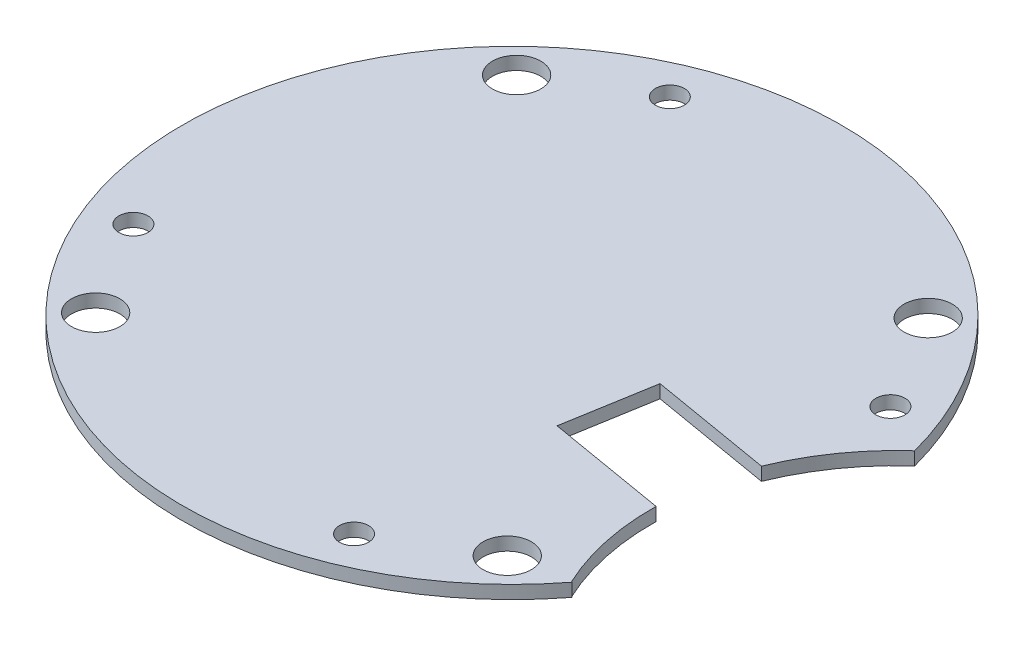
ISO-10303-21;
HEADER;
FILE_DESCRIPTION(('STEP AP214'),'2;1');
FILE_NAME('part.step','',(''),(''),'','','');
FILE_SCHEMA(('AUTOMOTIVE_DESIGN { 1 0 10303 214 1 1 1 1 }'));
ENDSEC;
DATA;
#1=APPLICATION_CONTEXT('core data for automotive mechanical design processes');
#2=APPLICATION_PROTOCOL_DEFINITION('international standard','automotive_design',2000,#1);
#3=PRODUCT_CONTEXT('',#1,'mechanical');
#4=PRODUCT('Part','Part','',(#3));
#5=PRODUCT_RELATED_PRODUCT_CATEGORY('part','',(#4));
#6=PRODUCT_DEFINITION_FORMATION('','',#4);
#7=PRODUCT_DEFINITION_CONTEXT('part definition',#1,'design');
#8=PRODUCT_DEFINITION('design','',#6,#7);
#9=PRODUCT_DEFINITION_SHAPE('','',#8);
#10=(LENGTH_UNIT() NAMED_UNIT(*) SI_UNIT(.MILLI.,.METRE.));
#11=(NAMED_UNIT(*) PLANE_ANGLE_UNIT() SI_UNIT($,.RADIAN.));
#12=(NAMED_UNIT(*) SI_UNIT($,.STERADIAN.) SOLID_ANGLE_UNIT());
#13=UNCERTAINTY_MEASURE_WITH_UNIT(LENGTH_MEASURE(1.E-05),#10,'distance_accuracy_value','');
#14=(GEOMETRIC_REPRESENTATION_CONTEXT(3) GLOBAL_UNCERTAINTY_ASSIGNED_CONTEXT((#13)) GLOBAL_UNIT_ASSIGNED_CONTEXT((#10,
#11,#12)) REPRESENTATION_CONTEXT('',''));
#15=CARTESIAN_POINT('',(0.,0.,0.));
#16=DIRECTION('',(0.,0.,1.));
#17=DIRECTION('',(1.,0.,0.));
#18=AXIS2_PLACEMENT_3D('',#15,#16,#17);
#19=CARTESIAN_POINT('',(0.,1.5,0.));
#20=DIRECTION('',(0.,-1.,0.));
#21=DIRECTION('',(0.,0.,-1.));
#22=AXIS2_PLACEMENT_3D('',#19,#20,#21);
#23=CYLINDRICAL_SURFACE('',#22,37.5);
#24=CARTESIAN_POINT('',(0.,0.,0.));
#25=DIRECTION('',(0.,1.,0.));
#26=DIRECTION('',(0.,0.,1.));
#27=AXIS2_PLACEMENT_3D('',#24,#25,#26);
#28=CIRCLE('',#27,37.5);
#29=CARTESIAN_POINT('',(36.2683420266121,0.,-9.53191306300501));
#30=VERTEX_POINT('',#29);
#31=CARTESIAN_POINT('',(29.7006641780445,0.,22.89367920154));
#32=VERTEX_POINT('',#31);
#33=EDGE_CURVE('E161',#30,#32,#28,.T.);
#34=ORIENTED_EDGE('',*,*,#33,.T.);
#35=DIRECTION('',(0.,1.,0.));
#36=VECTOR('',#35,1.);
#37=CARTESIAN_POINT('',(29.7006641780445,1.5,22.89367920154));
#38=LINE('',#37,#36);
#39=CARTESIAN_POINT('',(29.7006641780445,1.5,22.89367920154));
#40=VERTEX_POINT('',#39);
#41=EDGE_CURVE('E203',#32,#40,#38,.T.);
#42=ORIENTED_EDGE('',*,*,#41,.T.);
#43=CARTESIAN_POINT('',(0.,1.5,0.));
#44=DIRECTION('',(0.,1.,0.));
#45=DIRECTION('',(0.,0.,1.));
#46=AXIS2_PLACEMENT_3D('',#43,#44,#45);
#47=CIRCLE('',#46,37.5);
#48=CARTESIAN_POINT('',(36.2683420266121,1.5,-9.531913063005));
#49=VERTEX_POINT('',#48);
#50=EDGE_CURVE('E164',#49,#40,#47,.T.);
#51=ORIENTED_EDGE('',*,*,#50,.F.);
#52=DIRECTION('',(0.,1.,0.));
#53=VECTOR('',#52,1.);
#54=CARTESIAN_POINT('',(36.2683420266121,1.5,-9.531913063005));
#55=LINE('',#54,#53);
#56=EDGE_CURVE('E208',#49,#30,#55,.F.);
#57=ORIENTED_EDGE('',*,*,#56,.T.);
#58=EDGE_LOOP('',(#34,#42,#51,#57));
#59=FACE_BOUND('',#58,.T.);
#60=ADVANCED_FACE('F41',(#59),#23,.T.);
#61=CARTESIAN_POINT('',(0.,1.5,0.));
#62=DIRECTION('',(0.,1.,0.));
#63=DIRECTION('',(0.,0.,1.));
#64=AXIS2_PLACEMENT_3D('',#61,#62,#63);
#65=PLANE('',#64);
#66=CARTESIAN_POINT('',(23.0939339103995,1.5,4.67758667111403));
#67=DIRECTION('',(0.,1.,0.));
#68=DIRECTION('',(0.,0.,1.));
#69=AXIS2_PLACEMENT_3D('',#66,#67,#68);
#70=CIRCLE('',#69,19.3771750238898);
#71=CARTESIAN_POINT('',(36.2429687450715,1.5,-9.55539596862244));
#72=VERTEX_POINT('',#71);
#73=EDGE_CURVE('E206',#49,#72,#70,.T.);
#74=ORIENTED_EDGE('',*,*,#73,.F.);
#75=ORIENTED_EDGE('',*,*,#50,.T.);
#76=CARTESIAN_POINT('',(29.6578955464331,1.5,22.9091340422822));
#77=VERTEX_POINT('',#76);
#78=EDGE_CURVE('E202',#77,#40,#70,.T.);
#79=ORIENTED_EDGE('',*,*,#78,.F.);
#80=CARTESIAN_POINT('',(54.762257661761,1.5,11.1011581785659));
#81=DIRECTION('',(0.,1.,0.));
#82=DIRECTION('',(0.,0.,1.));
#83=AXIS2_PLACEMENT_3D('',#80,#81,#82);
#84=CIRCLE('',#83,27.7426979801103);
#85=CARTESIAN_POINT('',(27.0236814137866,1.5,10.6229542984922));
#86=VERTEX_POINT('',#85);
#87=EDGE_CURVE('E211',#86,#77,#84,.T.);
#88=ORIENTED_EDGE('',*,*,#87,.F.);
#89=DIRECTION('',(0.985864938916429,0.,0.167542001346843));
#90=VECTOR('',#89,1.);
#91=CARTESIAN_POINT('',(-0.99607012382513,1.5,5.86116080676652));
#92=LINE('',#91,#90);
#93=CARTESIAN_POINT('',(13.4506851765629,1.5,8.31630268315321));
#94=VERTEX_POINT('',#93);
#95=EDGE_CURVE('E213',#94,#86,#92,.T.);
#96=ORIENTED_EDGE('',*,*,#95,.F.);
#97=DIRECTION('',(-0.167542001346393,0.,0.985864938916506));
#98=VECTOR('',#97,1.);
#99=CARTESIAN_POINT('',(14.4467553003865,1.5,2.45514187637964));
#100=LINE('',#99,#98);
#101=CARTESIAN_POINT('',(15.1529110591266,1.5,-1.70008008803095));
#102=VERTEX_POINT('',#101);
#103=EDGE_CURVE('E215',#102,#94,#100,.T.);
#104=ORIENTED_EDGE('',*,*,#103,.F.);
#105=DIRECTION('',(-0.985864938916489,0.,-0.167542001346492));
#106=VECTOR('',#105,1.);
#107=CARTESIAN_POINT('',(0.706155758740759,1.5,-4.15522196441197));
#108=LINE('',#107,#106);
#109=CARTESIAN_POINT('',(29.0581188998045,1.5,0.663028953382543));
#110=VERTEX_POINT('',#109);
#111=EDGE_CURVE('E123',#110,#102,#108,.T.);
#112=ORIENTED_EDGE('',*,*,#111,.F.);
#113=CARTESIAN_POINT('',(54.762257661761,1.5,11.1011581785659));
#114=DIRECTION('',(0.,1.,0.));
#115=DIRECTION('',(0.,0.,1.));
#116=AXIS2_PLACEMENT_3D('',#113,#114,#115);
#117=CIRCLE('',#116,27.7426979801089);
#118=EDGE_CURVE('E65',#72,#110,#117,.T.);
#119=ORIENTED_EDGE('',*,*,#118,.F.);
#120=EDGE_LOOP('',(#74,#75,#79,#88,#96,#104,#112,#119));
#121=FACE_BOUND('',#120,.T.);
#122=CARTESIAN_POINT('',(-30.519872413592,1.5,12.5513898773731));
#123=DIRECTION('',(0.,1.,0.));
#124=DIRECTION('',(0.,0.,1.));
#125=AXIS2_PLACEMENT_3D('',#122,#123,#124);
#126=CIRCLE('',#125,1.65);
#127=CARTESIAN_POINT('',(-30.519872413592,1.5,14.2013898773731));
#128=VERTEX_POINT('',#127);
#129=EDGE_CURVE('E179',#128,#128,#126,.T.);
#130=ORIENTED_EDGE('',*,*,#129,.F.);
#131=EDGE_LOOP('',(#130));
#132=FACE_BOUND('',#131,.T.);
#133=CARTESIAN_POINT('',(23.9495809610721,1.5,-23.416394486041));
#134=DIRECTION('',(0.,1.,0.));
#135=DIRECTION('',(0.,0.,1.));
#136=AXIS2_PLACEMENT_3D('',#133,#134,#135);
#137=CIRCLE('',#136,2.75);
#138=CARTESIAN_POINT('',(23.9495809610721,1.5,-20.666394486041));
#139=VERTEX_POINT('',#138);
#140=EDGE_CURVE('E187',#139,#139,#137,.T.);
#141=ORIENTED_EDGE('',*,*,#140,.F.);
#142=EDGE_LOOP('',(#141));
#143=FACE_BOUND('',#142,.T.);
#144=CARTESIAN_POINT('',(23.4163944860967,1.5,23.9495809610161));
#145=DIRECTION('',(0.,1.,0.));
#146=DIRECTION('',(0.,0.,1.));
#147=AXIS2_PLACEMENT_3D('',#144,#145,#146);
#148=CIRCLE('',#147,2.75000000006971);
#149=CARTESIAN_POINT('',(23.4163944860967,1.5,26.6995809610858));
#150=VERTEX_POINT('',#149);
#151=EDGE_CURVE('E183',#150,#150,#148,.T.);
#152=ORIENTED_EDGE('',*,*,#151,.F.);
#153=EDGE_LOOP('',(#152));
#154=FACE_BOUND('',#153,.T.);
#155=CARTESIAN_POINT('',(-23.9495809609604,1.5,23.4163944860408));
#156=DIRECTION('',(0.,1.,0.));
#157=DIRECTION('',(0.,0.,1.));
#158=AXIS2_PLACEMENT_3D('',#155,#156,#157);
#159=CIRCLE('',#158,2.75000000003257);
#160=CARTESIAN_POINT('',(-23.9495809609604,1.5,26.1663944860733));
#161=VERTEX_POINT('',#160);
#162=EDGE_CURVE('E180',#161,#161,#159,.T.);
#163=ORIENTED_EDGE('',*,*,#162,.F.);
#164=EDGE_LOOP('',(#163));
#165=FACE_BOUND('',#164,.T.);
#166=CARTESIAN_POINT('',(-12.5513898771988,1.5,-30.5198724139989));
#167=DIRECTION('',(0.,1.,0.));
#168=DIRECTION('',(0.,0.,1.));
#169=AXIS2_PLACEMENT_3D('',#166,#167,#168);
#170=CIRCLE('',#169,1.65);
#171=CARTESIAN_POINT('',(-12.5513898771988,1.5,-28.8698724139989));
#172=VERTEX_POINT('',#171);
#173=EDGE_CURVE('E184',#172,#172,#170,.T.);
#174=ORIENTED_EDGE('',*,*,#173,.F.);
#175=EDGE_LOOP('',(#174));
#176=FACE_BOUND('',#175,.T.);
#177=CARTESIAN_POINT('',(30.5198724141732,1.5,-12.5513898776057));
#178=DIRECTION('',(0.,1.,0.));
#179=DIRECTION('',(0.,0.,1.));
#180=AXIS2_PLACEMENT_3D('',#177,#178,#179);
#181=CIRCLE('',#180,1.65);
#182=CARTESIAN_POINT('',(30.5198724141732,1.5,-10.9013898776057));
#183=VERTEX_POINT('',#182);
#184=EDGE_CURVE('E195',#183,#183,#181,.T.);
#185=ORIENTED_EDGE('',*,*,#184,.F.);
#186=EDGE_LOOP('',(#185));
#187=FACE_BOUND('',#186,.T.);
#188=CARTESIAN_POINT('',(12.55138987778,1.5,30.5198724137663));
#189=DIRECTION('',(0.,1.,0.));
#190=DIRECTION('',(0.,0.,1.));
#191=AXIS2_PLACEMENT_3D('',#188,#189,#190);
#192=CIRCLE('',#191,1.65);
#193=CARTESIAN_POINT('',(12.55138987778,1.5,32.1698724137663));
#194=VERTEX_POINT('',#193);
#195=EDGE_CURVE('E192',#194,#194,#192,.T.);
#196=ORIENTED_EDGE('',*,*,#195,.F.);
#197=EDGE_LOOP('',(#196));
#198=FACE_BOUND('',#197,.T.);
#199=CARTESIAN_POINT('',(-23.4163944859851,1.5,-23.9495809610164));
#200=DIRECTION('',(0.,1.,0.));
#201=DIRECTION('',(0.,0.,1.));
#202=AXIS2_PLACEMENT_3D('',#199,#200,#201);
#203=CIRCLE('',#202,2.74999999996265);
#204=CARTESIAN_POINT('',(-23.4163944859851,1.5,-21.1995809610538));
#205=VERTEX_POINT('',#204);
#206=EDGE_CURVE('E160',#205,#205,#203,.T.);
#207=ORIENTED_EDGE('',*,*,#206,.F.);
#208=EDGE_LOOP('',(#207));
#209=FACE_BOUND('',#208,.T.);
#210=ADVANCED_FACE('F229',(#121,#132,#143,#154,#165,#176,#187,#198,#209),#65,.T.);
#211=CARTESIAN_POINT('',(0.,0.,0.));
#212=DIRECTION('',(0.,1.,0.));
#213=DIRECTION('',(0.,0.,1.));
#214=AXIS2_PLACEMENT_3D('',#211,#212,#213);
#215=PLANE('',#214);
#216=ORIENTED_EDGE('',*,*,#33,.F.);
#217=CARTESIAN_POINT('',(23.0939339103995,0.,4.67758667111403));
#218=DIRECTION('',(0.,1.,0.));
#219=DIRECTION('',(0.,0.,1.));
#220=AXIS2_PLACEMENT_3D('',#217,#218,#219);
#221=CIRCLE('',#220,19.3771750238898);
#222=CARTESIAN_POINT('',(36.2429687450715,0.,-9.55539596862244));
#223=VERTEX_POINT('',#222);
#224=EDGE_CURVE('E11',#30,#223,#221,.T.);
#225=ORIENTED_EDGE('',*,*,#224,.T.);
#226=CARTESIAN_POINT('',(54.762257661761,0.,11.1011581785659));
#227=DIRECTION('',(0.,1.,0.));
#228=DIRECTION('',(0.,0.,1.));
#229=AXIS2_PLACEMENT_3D('',#226,#227,#228);
#230=CIRCLE('',#229,27.7426979801089);
#231=CARTESIAN_POINT('',(29.0581188998045,0.,0.663028953382543));
#232=VERTEX_POINT('',#231);
#233=EDGE_CURVE('E44',#223,#232,#230,.T.);
#234=ORIENTED_EDGE('',*,*,#233,.T.);
#235=DIRECTION('',(-0.985864938916489,0.,-0.167542001346492));
#236=VECTOR('',#235,1.);
#237=CARTESIAN_POINT('',(0.706155758740759,0.,-4.15522196441197));
#238=LINE('',#237,#236);
#239=CARTESIAN_POINT('',(15.1529110591266,0.,-1.70008008803095));
#240=VERTEX_POINT('',#239);
#241=EDGE_CURVE('E121',#232,#240,#238,.T.);
#242=ORIENTED_EDGE('',*,*,#241,.T.);
#243=DIRECTION('',(-0.167542001346393,0.,0.985864938916506));
#244=VECTOR('',#243,1.);
#245=CARTESIAN_POINT('',(14.4467553003865,0.,2.45514187637964));
#246=LINE('',#245,#244);
#247=CARTESIAN_POINT('',(13.4506851765629,0.,8.31630268315321));
#248=VERTEX_POINT('',#247);
#249=EDGE_CURVE('E108',#240,#248,#246,.T.);
#250=ORIENTED_EDGE('',*,*,#249,.T.);
#251=DIRECTION('',(0.985864938916429,0.,0.167542001346843));
#252=VECTOR('',#251,1.);
#253=CARTESIAN_POINT('',(-0.99607012382513,0.,5.86116080676652));
#254=LINE('',#253,#252);
#255=CARTESIAN_POINT('',(27.0236814137866,0.,10.6229542984922));
#256=VERTEX_POINT('',#255);
#257=EDGE_CURVE('E116',#248,#256,#254,.T.);
#258=ORIENTED_EDGE('',*,*,#257,.T.);
#259=CARTESIAN_POINT('',(54.762257661761,0.,11.1011581785659));
#260=DIRECTION('',(0.,1.,0.));
#261=DIRECTION('',(0.,0.,1.));
#262=AXIS2_PLACEMENT_3D('',#259,#260,#261);
#263=CIRCLE('',#262,27.7426979801103);
#264=CARTESIAN_POINT('',(29.6578955464331,0.,22.9091340422822));
#265=VERTEX_POINT('',#264);
#266=EDGE_CURVE('E130',#256,#265,#263,.T.);
#267=ORIENTED_EDGE('',*,*,#266,.T.);
#268=EDGE_CURVE('E50',#265,#32,#221,.T.);
#269=ORIENTED_EDGE('',*,*,#268,.T.);
#270=EDGE_LOOP('',(#216,#225,#234,#242,#250,#258,#267,#269));
#271=FACE_BOUND('',#270,.T.);
#272=CARTESIAN_POINT('',(-30.519872413592,0.,12.5513898773731));
#273=DIRECTION('',(0.,1.,0.));
#274=DIRECTION('',(0.,0.,1.));
#275=AXIS2_PLACEMENT_3D('',#272,#273,#274);
#276=CIRCLE('',#275,1.65);
#277=CARTESIAN_POINT('',(-30.519872413592,0.,14.2013898773731));
#278=VERTEX_POINT('',#277);
#279=EDGE_CURVE('E135',#278,#278,#276,.T.);
#280=ORIENTED_EDGE('',*,*,#279,.T.);
#281=EDGE_LOOP('',(#280));
#282=FACE_BOUND('',#281,.T.);
#283=CARTESIAN_POINT('',(23.9495809610721,0.,-23.416394486041));
#284=DIRECTION('',(0.,1.,0.));
#285=DIRECTION('',(0.,0.,1.));
#286=AXIS2_PLACEMENT_3D('',#283,#284,#285);
#287=CIRCLE('',#286,2.75);
#288=CARTESIAN_POINT('',(23.9495809610721,0.,-20.666394486041));
#289=VERTEX_POINT('',#288);
#290=EDGE_CURVE('E139',#289,#289,#287,.T.);
#291=ORIENTED_EDGE('',*,*,#290,.T.);
#292=EDGE_LOOP('',(#291));
#293=FACE_BOUND('',#292,.T.);
#294=CARTESIAN_POINT('',(23.4163944860967,0.,23.9495809610161));
#295=DIRECTION('',(0.,1.,0.));
#296=DIRECTION('',(0.,0.,1.));
#297=AXIS2_PLACEMENT_3D('',#294,#295,#296);
#298=CIRCLE('',#297,2.75000000006971);
#299=CARTESIAN_POINT('',(23.4163944860967,0.,26.6995809610858));
#300=VERTEX_POINT('',#299);
#301=EDGE_CURVE('E142',#300,#300,#298,.T.);
#302=ORIENTED_EDGE('',*,*,#301,.T.);
#303=EDGE_LOOP('',(#302));
#304=FACE_BOUND('',#303,.T.);
#305=CARTESIAN_POINT('',(-23.9495809609604,0.,23.4163944860408));
#306=DIRECTION('',(0.,1.,0.));
#307=DIRECTION('',(0.,0.,1.));
#308=AXIS2_PLACEMENT_3D('',#305,#306,#307);
#309=CIRCLE('',#308,2.75000000003257);
#310=CARTESIAN_POINT('',(-23.9495809609604,0.,26.1663944860733));
#311=VERTEX_POINT('',#310);
#312=EDGE_CURVE('E145',#311,#311,#309,.T.);
#313=ORIENTED_EDGE('',*,*,#312,.T.);
#314=EDGE_LOOP('',(#313));
#315=FACE_BOUND('',#314,.T.);
#316=CARTESIAN_POINT('',(-12.5513898771988,0.,-30.5198724139989));
#317=DIRECTION('',(0.,1.,0.));
#318=DIRECTION('',(0.,0.,1.));
#319=AXIS2_PLACEMENT_3D('',#316,#317,#318);
#320=CIRCLE('',#319,1.65);
#321=CARTESIAN_POINT('',(-12.5513898771988,0.,-28.8698724139989));
#322=VERTEX_POINT('',#321);
#323=EDGE_CURVE('E148',#322,#322,#320,.T.);
#324=ORIENTED_EDGE('',*,*,#323,.T.);
#325=EDGE_LOOP('',(#324));
#326=FACE_BOUND('',#325,.T.);
#327=CARTESIAN_POINT('',(30.5198724141732,0.,-12.5513898776057));
#328=DIRECTION('',(0.,1.,0.));
#329=DIRECTION('',(0.,0.,1.));
#330=AXIS2_PLACEMENT_3D('',#327,#328,#329);
#331=CIRCLE('',#330,1.65);
#332=CARTESIAN_POINT('',(30.5198724141732,0.,-10.9013898776057));
#333=VERTEX_POINT('',#332);
#334=EDGE_CURVE('E151',#333,#333,#331,.T.);
#335=ORIENTED_EDGE('',*,*,#334,.T.);
#336=EDGE_LOOP('',(#335));
#337=FACE_BOUND('',#336,.T.);
#338=CARTESIAN_POINT('',(12.55138987778,0.,30.5198724137663));
#339=DIRECTION('',(0.,1.,0.));
#340=DIRECTION('',(0.,0.,1.));
#341=AXIS2_PLACEMENT_3D('',#338,#339,#340);
#342=CIRCLE('',#341,1.65);
#343=CARTESIAN_POINT('',(12.55138987778,0.,32.1698724137663));
#344=VERTEX_POINT('',#343);
#345=EDGE_CURVE('E154',#344,#344,#342,.T.);
#346=ORIENTED_EDGE('',*,*,#345,.T.);
#347=EDGE_LOOP('',(#346));
#348=FACE_BOUND('',#347,.T.);
#349=CARTESIAN_POINT('',(-23.4163944859851,0.,-23.9495809610164));
#350=DIRECTION('',(0.,1.,0.));
#351=DIRECTION('',(0.,0.,1.));
#352=AXIS2_PLACEMENT_3D('',#349,#350,#351);
#353=CIRCLE('',#352,2.74999999996265);
#354=CARTESIAN_POINT('',(-23.4163944859851,0.,-21.1995809610538));
#355=VERTEX_POINT('',#354);
#356=EDGE_CURVE('E157',#355,#355,#353,.T.);
#357=ORIENTED_EDGE('',*,*,#356,.T.);
#358=EDGE_LOOP('',(#357));
#359=FACE_BOUND('',#358,.T.);
#360=CARTESIAN_POINT('',(0.,0.,0.));
#361=DIRECTION('',(0.,-1.,0.));
#362=DIRECTION('',(0.,0.,-1.));
#363=AXIS2_PLACEMENT_3D('',#360,#361,#362);
#364=CIRCLE('',#363,7.25);
#365=CARTESIAN_POINT('',(0.,0.,-7.25));
#366=VERTEX_POINT('',#365);
#367=EDGE_CURVE('E117',#366,#366,#364,.T.);
#368=ORIENTED_EDGE('',*,*,#367,.F.);
#369=EDGE_LOOP('',(#368));
#370=FACE_BOUND('',#369,.T.);
#371=ADVANCED_FACE('F127',(#271,#282,#293,#304,#315,#326,#337,#348,#359,#370),#215,.F.);
#372=CARTESIAN_POINT('',(0.,-6.,0.));
#373=DIRECTION('',(0.,1.,0.));
#374=DIRECTION('',(0.,0.,1.));
#375=AXIS2_PLACEMENT_3D('',#372,#373,#374);
#376=CYLINDRICAL_SURFACE('',#375,7.25);
#377=CARTESIAN_POINT('',(0.,-6.,0.));
#378=DIRECTION('',(0.,-1.,0.));
#379=DIRECTION('',(0.,0.,-1.));
#380=AXIS2_PLACEMENT_3D('',#377,#378,#379);
#381=CIRCLE('',#380,7.25);
#382=CARTESIAN_POINT('',(0.,-6.,-7.25));
#383=VERTEX_POINT('',#382);
#384=EDGE_CURVE('E165',#383,#383,#381,.T.);
#385=ORIENTED_EDGE('',*,*,#384,.F.);
#386=EDGE_LOOP('',(#385));
#387=FACE_BOUND('',#386,.T.);
#388=ORIENTED_EDGE('',*,*,#367,.T.);
#389=EDGE_LOOP('',(#388));
#390=FACE_BOUND('',#389,.T.);
#391=ADVANCED_FACE('F266',(#387,#390),#376,.T.);
#392=CARTESIAN_POINT('',(0.,-6.,0.));
#393=DIRECTION('',(0.,-1.,0.));
#394=DIRECTION('',(0.,0.,-1.));
#395=AXIS2_PLACEMENT_3D('',#392,#393,#394);
#396=PLANE('',#395);
#397=CARTESIAN_POINT('',(0.,-6.,0.));
#398=DIRECTION('',(0.,-1.,0.));
#399=DIRECTION('',(0.,0.,-1.));
#400=AXIS2_PLACEMENT_3D('',#397,#398,#399);
#401=CIRCLE('',#400,5.5);
#402=CARTESIAN_POINT('',(0.,-6.,-5.5));
#403=VERTEX_POINT('',#402);
#404=EDGE_CURVE('E138',#403,#403,#401,.T.);
#405=ORIENTED_EDGE('',*,*,#404,.F.);
#406=EDGE_LOOP('',(#405));
#407=FACE_BOUND('',#406,.T.);
#408=ORIENTED_EDGE('',*,*,#384,.T.);
#409=EDGE_LOOP('',(#408));
#410=FACE_BOUND('',#409,.T.);
#411=ADVANCED_FACE('F270',(#407,#410),#396,.T.);
#412=CARTESIAN_POINT('',(0.,1.,0.));
#413=DIRECTION('',(0.,-1.,0.));
#414=DIRECTION('',(0.,0.,-1.));
#415=AXIS2_PLACEMENT_3D('',#412,#413,#414);
#416=CYLINDRICAL_SURFACE('',#415,5.5);
#417=CARTESIAN_POINT('',(0.,1.,0.));
#418=DIRECTION('',(0.,-1.,0.));
#419=DIRECTION('',(0.,0.,-1.));
#420=AXIS2_PLACEMENT_3D('',#417,#418,#419);
#421=CIRCLE('',#420,5.5);
#422=CARTESIAN_POINT('',(0.,1.,-5.5));
#423=VERTEX_POINT('',#422);
#424=EDGE_CURVE('E172',#423,#423,#421,.T.);
#425=ORIENTED_EDGE('',*,*,#424,.F.);
#426=EDGE_LOOP('',(#425));
#427=FACE_BOUND('',#426,.T.);
#428=ORIENTED_EDGE('',*,*,#404,.T.);
#429=EDGE_LOOP('',(#428));
#430=FACE_BOUND('',#429,.T.);
#431=ADVANCED_FACE('F274',(#427,#430),#416,.F.);
#432=CARTESIAN_POINT('',(0.,1.,0.));
#433=DIRECTION('',(0.,-1.,0.));
#434=DIRECTION('',(0.,0.,-1.));
#435=AXIS2_PLACEMENT_3D('',#432,#433,#434);
#436=PLANE('',#435);
#437=ORIENTED_EDGE('',*,*,#424,.T.);
#438=EDGE_LOOP('',(#437));
#439=FACE_BOUND('',#438,.T.);
#440=ADVANCED_FACE('F278',(#439),#436,.T.);
#441=CARTESIAN_POINT('',(-23.4163944859851,-8.5,-23.9495809610164));
#442=DIRECTION('',(0.,1.,0.));
#443=DIRECTION('',(0.,0.,1.));
#444=AXIS2_PLACEMENT_3D('',#441,#442,#443);
#445=CYLINDRICAL_SURFACE('',#444,2.74999999996265);
#446=ORIENTED_EDGE('',*,*,#206,.T.);
#447=EDGE_LOOP('',(#446));
#448=FACE_BOUND('',#447,.T.);
#449=ORIENTED_EDGE('',*,*,#356,.F.);
#450=EDGE_LOOP('',(#449));
#451=FACE_BOUND('',#450,.T.);
#452=ADVANCED_FACE('F282',(#448,#451),#445,.F.);
#453=CARTESIAN_POINT('',(12.55138987778,-8.5,30.5198724137663));
#454=DIRECTION('',(0.,1.,0.));
#455=DIRECTION('',(0.,0.,1.));
#456=AXIS2_PLACEMENT_3D('',#453,#454,#455);
#457=CYLINDRICAL_SURFACE('',#456,1.65);
#458=ORIENTED_EDGE('',*,*,#195,.T.);
#459=EDGE_LOOP('',(#458));
#460=FACE_BOUND('',#459,.T.);
#461=ORIENTED_EDGE('',*,*,#345,.F.);
#462=EDGE_LOOP('',(#461));
#463=FACE_BOUND('',#462,.T.);
#464=ADVANCED_FACE('F286',(#460,#463),#457,.F.);
#465=CARTESIAN_POINT('',(30.5198724141732,-8.5,-12.5513898776057));
#466=DIRECTION('',(0.,1.,0.));
#467=DIRECTION('',(0.,0.,1.));
#468=AXIS2_PLACEMENT_3D('',#465,#466,#467);
#469=CYLINDRICAL_SURFACE('',#468,1.65);
#470=ORIENTED_EDGE('',*,*,#184,.T.);
#471=EDGE_LOOP('',(#470));
#472=FACE_BOUND('',#471,.T.);
#473=ORIENTED_EDGE('',*,*,#334,.F.);
#474=EDGE_LOOP('',(#473));
#475=FACE_BOUND('',#474,.T.);
#476=ADVANCED_FACE('F305',(#472,#475),#469,.F.);
#477=CARTESIAN_POINT('',(-12.5513898771988,-8.5,-30.5198724139989));
#478=DIRECTION('',(0.,1.,0.));
#479=DIRECTION('',(0.,0.,1.));
#480=AXIS2_PLACEMENT_3D('',#477,#478,#479);
#481=CYLINDRICAL_SURFACE('',#480,1.65);
#482=ORIENTED_EDGE('',*,*,#173,.T.);
#483=EDGE_LOOP('',(#482));
#484=FACE_BOUND('',#483,.T.);
#485=ORIENTED_EDGE('',*,*,#323,.F.);
#486=EDGE_LOOP('',(#485));
#487=FACE_BOUND('',#486,.T.);
#488=ADVANCED_FACE('F292',(#484,#487),#481,.F.);
#489=CARTESIAN_POINT('',(-23.9495809609604,-8.5,23.4163944860408));
#490=DIRECTION('',(0.,1.,0.));
#491=DIRECTION('',(0.,0.,1.));
#492=AXIS2_PLACEMENT_3D('',#489,#490,#491);
#493=CYLINDRICAL_SURFACE('',#492,2.75000000003257);
#494=ORIENTED_EDGE('',*,*,#162,.T.);
#495=EDGE_LOOP('',(#494));
#496=FACE_BOUND('',#495,.T.);
#497=ORIENTED_EDGE('',*,*,#312,.F.);
#498=EDGE_LOOP('',(#497));
#499=FACE_BOUND('',#498,.T.);
#500=ADVANCED_FACE('F288',(#496,#499),#493,.F.);
#501=CARTESIAN_POINT('',(23.4163944860967,-8.5,23.9495809610161));
#502=DIRECTION('',(0.,1.,0.));
#503=DIRECTION('',(0.,0.,1.));
#504=AXIS2_PLACEMENT_3D('',#501,#502,#503);
#505=CYLINDRICAL_SURFACE('',#504,2.75000000006971);
#506=ORIENTED_EDGE('',*,*,#151,.T.);
#507=EDGE_LOOP('',(#506));
#508=FACE_BOUND('',#507,.T.);
#509=ORIENTED_EDGE('',*,*,#301,.F.);
#510=EDGE_LOOP('',(#509));
#511=FACE_BOUND('',#510,.T.);
#512=ADVANCED_FACE('F291',(#508,#511),#505,.F.);
#513=CARTESIAN_POINT('',(23.9495809610721,-8.5,-23.416394486041));
#514=DIRECTION('',(0.,1.,0.));
#515=DIRECTION('',(0.,0.,1.));
#516=AXIS2_PLACEMENT_3D('',#513,#514,#515);
#517=CYLINDRICAL_SURFACE('',#516,2.75);
#518=ORIENTED_EDGE('',*,*,#140,.T.);
#519=EDGE_LOOP('',(#518));
#520=FACE_BOUND('',#519,.T.);
#521=ORIENTED_EDGE('',*,*,#290,.F.);
#522=EDGE_LOOP('',(#521));
#523=FACE_BOUND('',#522,.T.);
#524=ADVANCED_FACE('F296',(#520,#523),#517,.F.);
#525=CARTESIAN_POINT('',(-30.519872413592,-8.5,12.5513898773731));
#526=DIRECTION('',(0.,1.,0.));
#527=DIRECTION('',(0.,0.,1.));
#528=AXIS2_PLACEMENT_3D('',#525,#526,#527);
#529=CYLINDRICAL_SURFACE('',#528,1.65);
#530=ORIENTED_EDGE('',*,*,#129,.T.);
#531=EDGE_LOOP('',(#530));
#532=FACE_BOUND('',#531,.T.);
#533=ORIENTED_EDGE('',*,*,#279,.F.);
#534=EDGE_LOOP('',(#533));
#535=FACE_BOUND('',#534,.T.);
#536=ADVANCED_FACE('F255',(#532,#535),#529,.F.);
#537=CARTESIAN_POINT('',(29.0581188998045,-3.5,0.66302895338255));
#538=DIRECTION('',(0.167542001346492,0.,-0.985864938916489));
#539=DIRECTION('',(-0.985864938916489,0.,-0.167542001346492));
#540=AXIS2_PLACEMENT_3D('',#537,#538,#539);
#541=PLANE('',#540);
#542=ORIENTED_EDGE('',*,*,#111,.T.);
#543=DIRECTION('',(0.,1.,0.));
#544=VECTOR('',#543,1.);
#545=CARTESIAN_POINT('',(15.1529110591266,-3.5,-1.70008008803095));
#546=LINE('',#545,#544);
#547=EDGE_CURVE('E111',#240,#102,#546,.T.);
#548=ORIENTED_EDGE('',*,*,#547,.F.);
#549=ORIENTED_EDGE('',*,*,#241,.F.);
#550=DIRECTION('',(0.,1.,0.));
#551=VECTOR('',#550,1.);
#552=CARTESIAN_POINT('',(29.0581188998045,-3.5,0.663028953382543));
#553=LINE('',#552,#551);
#554=EDGE_CURVE('E216',#232,#110,#553,.T.);
#555=ORIENTED_EDGE('',*,*,#554,.T.);
#556=EDGE_LOOP('',(#542,#548,#549,#555));
#557=FACE_BOUND('',#556,.T.);
#558=ADVANCED_FACE('F120',(#557),#541,.F.);
#559=CARTESIAN_POINT('',(54.762257661761,-3.5,11.1011581785659));
#560=DIRECTION('',(0.,1.,0.));
#561=DIRECTION('',(0.,0.,1.));
#562=AXIS2_PLACEMENT_3D('',#559,#560,#561);
#563=CYLINDRICAL_SURFACE('',#562,27.7426979801089);
#564=ORIENTED_EDGE('',*,*,#118,.T.);
#565=ORIENTED_EDGE('',*,*,#554,.F.);
#566=ORIENTED_EDGE('',*,*,#233,.F.);
#567=DIRECTION('',(0.,1.,0.));
#568=VECTOR('',#567,1.);
#569=CARTESIAN_POINT('',(36.2429687450715,-3.5,-9.55539596862244));
#570=LINE('',#569,#568);
#571=EDGE_CURVE('E225',#223,#72,#570,.T.);
#572=ORIENTED_EDGE('',*,*,#571,.T.);
#573=EDGE_LOOP('',(#564,#565,#566,#572));
#574=FACE_BOUND('',#573,.T.);
#575=ADVANCED_FACE('F247',(#574),#563,.F.);
#576=CARTESIAN_POINT('',(23.0939339103995,-3.5,4.67758667111403));
#577=DIRECTION('',(0.,1.,0.));
#578=DIRECTION('',(0.,0.,1.));
#579=AXIS2_PLACEMENT_3D('',#576,#577,#578);
#580=CYLINDRICAL_SURFACE('',#579,19.3771750238898);
#581=ORIENTED_EDGE('',*,*,#78,.T.);
#582=ORIENTED_EDGE('',*,*,#41,.F.);
#583=ORIENTED_EDGE('',*,*,#268,.F.);
#584=DIRECTION('',(0.,1.,0.));
#585=VECTOR('',#584,1.);
#586=CARTESIAN_POINT('',(29.6578955464331,-3.5,22.9091340422822));
#587=LINE('',#586,#585);
#588=EDGE_CURVE('E222',#265,#77,#587,.T.);
#589=ORIENTED_EDGE('',*,*,#588,.T.);
#590=EDGE_LOOP('',(#581,#582,#583,#589));
#591=FACE_BOUND('',#590,.T.);
#592=ADVANCED_FACE('F241',(#591),#580,.F.);
#593=CARTESIAN_POINT('',(54.762257661761,-3.5,11.1011581785659));
#594=DIRECTION('',(0.,1.,0.));
#595=DIRECTION('',(0.,0.,1.));
#596=AXIS2_PLACEMENT_3D('',#593,#594,#595);
#597=CYLINDRICAL_SURFACE('',#596,27.7426979801103);
#598=ORIENTED_EDGE('',*,*,#87,.T.);
#599=ORIENTED_EDGE('',*,*,#588,.F.);
#600=ORIENTED_EDGE('',*,*,#266,.F.);
#601=DIRECTION('',(0.,1.,0.));
#602=VECTOR('',#601,1.);
#603=CARTESIAN_POINT('',(27.0236814137866,-3.5,10.6229542984922));
#604=LINE('',#603,#602);
#605=EDGE_CURVE('E219',#256,#86,#604,.T.);
#606=ORIENTED_EDGE('',*,*,#605,.T.);
#607=EDGE_LOOP('',(#598,#599,#600,#606));
#608=FACE_BOUND('',#607,.T.);
#609=ADVANCED_FACE('F238',(#608),#597,.F.);
#610=CARTESIAN_POINT('',(13.4506851765629,-3.5,8.31630268315321));
#611=DIRECTION('',(-0.167542001346843,0.,0.985864938916429));
#612=DIRECTION('',(0.985864938916429,0.,0.167542001346843));
#613=AXIS2_PLACEMENT_3D('',#610,#611,#612);
#614=PLANE('',#613);
#615=ORIENTED_EDGE('',*,*,#95,.T.);
#616=ORIENTED_EDGE('',*,*,#605,.F.);
#617=ORIENTED_EDGE('',*,*,#257,.F.);
#618=DIRECTION('',(0.,1.,0.));
#619=VECTOR('',#618,1.);
#620=CARTESIAN_POINT('',(13.4506851765629,-3.5,8.31630268315321));
#621=LINE('',#620,#619);
#622=EDGE_CURVE('E57',#248,#94,#621,.T.);
#623=ORIENTED_EDGE('',*,*,#622,.T.);
#624=EDGE_LOOP('',(#615,#616,#617,#623));
#625=FACE_BOUND('',#624,.T.);
#626=ADVANCED_FACE('F234',(#625),#614,.F.);
#627=CARTESIAN_POINT('',(15.1529110591266,-3.5,-1.70008008803095));
#628=DIRECTION('',(-0.985864938916506,0.,-0.167542001346393));
#629=DIRECTION('',(-0.167542001346393,0.,0.985864938916506));
#630=AXIS2_PLACEMENT_3D('',#627,#628,#629);
#631=PLANE('',#630);
#632=ORIENTED_EDGE('',*,*,#103,.T.);
#633=ORIENTED_EDGE('',*,*,#622,.F.);
#634=ORIENTED_EDGE('',*,*,#249,.F.);
#635=ORIENTED_EDGE('',*,*,#547,.T.);
#636=EDGE_LOOP('',(#632,#633,#634,#635));
#637=FACE_BOUND('',#636,.T.);
#638=ADVANCED_FACE('F110',(#637),#631,.F.);
#639=ORIENTED_EDGE('',*,*,#73,.T.);
#640=ORIENTED_EDGE('',*,*,#571,.F.);
#641=ORIENTED_EDGE('',*,*,#224,.F.);
#642=ORIENTED_EDGE('',*,*,#56,.F.);
#643=EDGE_LOOP('',(#639,#640,#641,#642));
#644=FACE_BOUND('',#643,.T.);
#645=ADVANCED_FACE('F246',(#644),#580,.F.);
#646=CLOSED_SHELL('',(#60,#210,#371,#391,#411,#431,#440,#452,#464,#476,#488,#500,#512,#524,#536,
#558,#575,#592,#609,#626,#638,#645));
#647=MANIFOLD_SOLID_BREP('B2',#646);
#648=ADVANCED_BREP_SHAPE_REPRESENTATION('',(#18,#647),#14);
#649=SHAPE_DEFINITION_REPRESENTATION(#9,#648);
ENDSEC;
END-ISO-10303-21;
